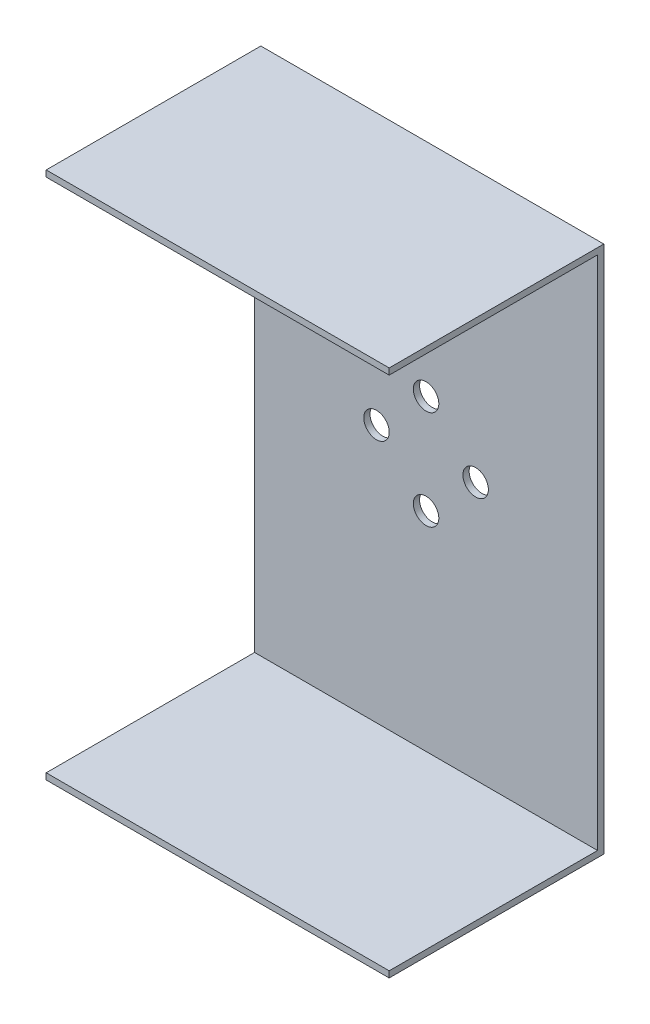
ISO-10303-21;
HEADER;
FILE_DESCRIPTION(('STEP AP214'),'2;1');
FILE_NAME('part.step','',(''),(''),'','','');
FILE_SCHEMA(('AUTOMOTIVE_DESIGN { 1 0 10303 214 1 1 1 1 }'));
ENDSEC;
DATA;
#1=APPLICATION_CONTEXT('core data for automotive mechanical design processes');
#2=APPLICATION_PROTOCOL_DEFINITION('international standard','automotive_design',2000,#1);
#3=PRODUCT_CONTEXT('',#1,'mechanical');
#4=PRODUCT('Part','Part','',(#3));
#5=PRODUCT_RELATED_PRODUCT_CATEGORY('part','',(#4));
#6=PRODUCT_DEFINITION_FORMATION('','',#4);
#7=PRODUCT_DEFINITION_CONTEXT('part definition',#1,'design');
#8=PRODUCT_DEFINITION('design','',#6,#7);
#9=PRODUCT_DEFINITION_SHAPE('','',#8);
#10=(LENGTH_UNIT() NAMED_UNIT(*) SI_UNIT(.MILLI.,.METRE.));
#11=(NAMED_UNIT(*) PLANE_ANGLE_UNIT() SI_UNIT($,.RADIAN.));
#12=(NAMED_UNIT(*) SI_UNIT($,.STERADIAN.) SOLID_ANGLE_UNIT());
#13=UNCERTAINTY_MEASURE_WITH_UNIT(LENGTH_MEASURE(1.E-05),#10,'distance_accuracy_value','');
#14=(GEOMETRIC_REPRESENTATION_CONTEXT(3) GLOBAL_UNCERTAINTY_ASSIGNED_CONTEXT((#13)) GLOBAL_UNIT_ASSIGNED_CONTEXT((#10,
#11,#12)) REPRESENTATION_CONTEXT('',''));
#15=CARTESIAN_POINT('',(0.,0.,0.));
#16=DIRECTION('',(0.,0.,1.));
#17=DIRECTION('',(1.,0.,0.));
#18=AXIS2_PLACEMENT_3D('',#15,#16,#17);
#19=CARTESIAN_POINT('',(87.89068,0.,-55.));
#20=DIRECTION('',(0.,-1.,0.));
#21=DIRECTION('',(0.,0.,-1.));
#22=AXIS2_PLACEMENT_3D('',#19,#20,#21);
#23=PLANE('',#22);
#24=DIRECTION('',(0.,0.,1.));
#25=VECTOR('',#24,1.);
#26=CARTESIAN_POINT('',(0.,0.,-55.));
#27=LINE('',#26,#25);
#28=CARTESIAN_POINT('',(0.,0.,-55.));
#29=VERTEX_POINT('',#28);
#30=CARTESIAN_POINT('',(0.,0.,0.));
#31=VERTEX_POINT('',#30);
#32=EDGE_CURVE('E144',#29,#31,#27,.T.);
#33=ORIENTED_EDGE('',*,*,#32,.T.);
#34=DIRECTION('',(-1.,0.,0.));
#35=VECTOR('',#34,1.);
#36=CARTESIAN_POINT('',(87.89068,0.,0.));
#37=LINE('',#36,#35);
#38=CARTESIAN_POINT('',(87.89068,0.,0.));
#39=VERTEX_POINT('',#38);
#40=EDGE_CURVE('E11',#39,#31,#37,.T.);
#41=ORIENTED_EDGE('',*,*,#40,.F.);
#42=DIRECTION('',(0.,0.,1.));
#43=VECTOR('',#42,1.);
#44=CARTESIAN_POINT('',(87.89068,0.,-55.));
#45=LINE('',#44,#43);
#46=CARTESIAN_POINT('',(87.89068,0.,-55.));
#47=VERTEX_POINT('',#46);
#48=EDGE_CURVE('E167',#47,#39,#45,.T.);
#49=ORIENTED_EDGE('',*,*,#48,.F.);
#50=DIRECTION('',(-1.,0.,0.));
#51=VECTOR('',#50,1.);
#52=CARTESIAN_POINT('',(87.89068,0.,-55.));
#53=LINE('',#52,#51);
#54=EDGE_CURVE('E140',#47,#29,#53,.T.);
#55=ORIENTED_EDGE('',*,*,#54,.T.);
#56=EDGE_LOOP('',(#33,#41,#49,#55));
#57=FACE_BOUND('',#56,.T.);
#58=ADVANCED_FACE('F43',(#57),#23,.F.);
#59=CARTESIAN_POINT('',(87.89068,0.,0.));
#60=DIRECTION('',(0.,0.,-1.));
#61=DIRECTION('',(0.,1.,0.));
#62=AXIS2_PLACEMENT_3D('',#59,#60,#61);
#63=PLANE('',#62);
#64=DIRECTION('',(0.,-1.,0.));
#65=VECTOR('',#64,1.);
#66=CARTESIAN_POINT('',(0.,0.,0.));
#67=LINE('',#66,#65);
#68=CARTESIAN_POINT('',(0.,-1.6002,0.));
#69=VERTEX_POINT('',#68);
#70=EDGE_CURVE('E148',#31,#69,#67,.T.);
#71=ORIENTED_EDGE('',*,*,#70,.T.);
#72=DIRECTION('',(-1.,0.,0.));
#73=VECTOR('',#72,1.);
#74=CARTESIAN_POINT('',(87.89068,-1.6002,0.));
#75=LINE('',#74,#73);
#76=CARTESIAN_POINT('',(87.89068,-1.6002,0.));
#77=VERTEX_POINT('',#76);
#78=EDGE_CURVE('E52',#77,#69,#75,.T.);
#79=ORIENTED_EDGE('',*,*,#78,.F.);
#80=DIRECTION('',(0.,-1.,0.));
#81=VECTOR('',#80,1.);
#82=CARTESIAN_POINT('',(87.89068,0.,0.));
#83=LINE('',#82,#81);
#84=EDGE_CURVE('E103',#39,#77,#83,.T.);
#85=ORIENTED_EDGE('',*,*,#84,.F.);
#86=ORIENTED_EDGE('',*,*,#40,.T.);
#87=EDGE_LOOP('',(#71,#79,#85,#86));
#88=FACE_BOUND('',#87,.T.);
#89=ADVANCED_FACE('F269',(#88),#63,.F.);
#90=CARTESIAN_POINT('',(87.89068,-1.6002,0.));
#91=DIRECTION('',(0.,1.,0.));
#92=DIRECTION('',(0.,0.,1.));
#93=AXIS2_PLACEMENT_3D('',#90,#91,#92);
#94=PLANE('',#93);
#95=DIRECTION('',(0.,0.,-1.));
#96=VECTOR('',#95,1.);
#97=CARTESIAN_POINT('',(0.,-1.6002,0.));
#98=LINE('',#97,#96);
#99=CARTESIAN_POINT('',(0.,-1.6002,-53.3998));
#100=VERTEX_POINT('',#99);
#101=EDGE_CURVE('E152',#69,#100,#98,.T.);
#102=ORIENTED_EDGE('',*,*,#101,.T.);
#103=DIRECTION('',(-1.,0.,0.));
#104=VECTOR('',#103,1.);
#105=CARTESIAN_POINT('',(87.89068,-1.6002,-53.3998));
#106=LINE('',#105,#104);
#107=CARTESIAN_POINT('',(87.89068,-1.6002,-53.3998));
#108=VERTEX_POINT('',#107);
#109=EDGE_CURVE('E178',#108,#100,#106,.T.);
#110=ORIENTED_EDGE('',*,*,#109,.F.);
#111=DIRECTION('',(0.,0.,-1.));
#112=VECTOR('',#111,1.);
#113=CARTESIAN_POINT('',(87.89068,-1.6002,0.));
#114=LINE('',#113,#112);
#115=EDGE_CURVE('E188',#77,#108,#114,.T.);
#116=ORIENTED_EDGE('',*,*,#115,.F.);
#117=ORIENTED_EDGE('',*,*,#78,.T.);
#118=EDGE_LOOP('',(#102,#110,#116,#117));
#119=FACE_BOUND('',#118,.T.);
#120=ADVANCED_FACE('F186',(#119),#94,.F.);
#121=CARTESIAN_POINT('',(87.89068,-1.6002,-53.3998));
#122=DIRECTION('',(0.,0.,-1.));
#123=DIRECTION('',(0.,1.,0.));
#124=AXIS2_PLACEMENT_3D('',#121,#122,#123);
#125=PLANE('',#124);
#126=CARTESIAN_POINT('',(43.94534,-54.99395,-53.3998));
#127=DIRECTION('',(0.,0.,1.));
#128=DIRECTION('',(1.,0.,0.));
#129=AXIS2_PLACEMENT_3D('',#126,#127,#128);
#130=CIRCLE('',#129,3.2639);
#131=CARTESIAN_POINT('',(47.20924,-54.99395,-53.3998));
#132=VERTEX_POINT('',#131);
#133=EDGE_CURVE('E232',#132,#132,#130,.T.);
#134=ORIENTED_EDGE('',*,*,#133,.F.);
#135=EDGE_LOOP('',(#134));
#136=FACE_BOUND('',#135,.T.);
#137=CARTESIAN_POINT('',(43.94534,-80.39395,-53.3998));
#138=DIRECTION('',(0.,0.,1.));
#139=DIRECTION('',(1.,0.,0.));
#140=AXIS2_PLACEMENT_3D('',#137,#138,#139);
#141=CIRCLE('',#140,3.2639);
#142=CARTESIAN_POINT('',(47.20924,-80.39395,-53.3998));
#143=VERTEX_POINT('',#142);
#144=EDGE_CURVE('E228',#143,#143,#141,.T.);
#145=ORIENTED_EDGE('',*,*,#144,.F.);
#146=EDGE_LOOP('',(#145));
#147=FACE_BOUND('',#146,.T.);
#148=CARTESIAN_POINT('',(31.24534,-67.69395,-53.3998));
#149=DIRECTION('',(0.,0.,1.));
#150=DIRECTION('',(1.,0.,0.));
#151=AXIS2_PLACEMENT_3D('',#148,#149,#150);
#152=CIRCLE('',#151,3.26390000000002);
#153=CARTESIAN_POINT('',(34.50924,-67.69395,-53.3998));
#154=VERTEX_POINT('',#153);
#155=EDGE_CURVE('E220',#154,#154,#152,.T.);
#156=ORIENTED_EDGE('',*,*,#155,.F.);
#157=EDGE_LOOP('',(#156));
#158=FACE_BOUND('',#157,.T.);
#159=CARTESIAN_POINT('',(56.64534,-67.69395,-53.3998));
#160=DIRECTION('',(0.,0.,1.));
#161=DIRECTION('',(1.,0.,0.));
#162=AXIS2_PLACEMENT_3D('',#159,#160,#161);
#163=CIRCLE('',#162,3.2639);
#164=CARTESIAN_POINT('',(59.90924,-67.69395,-53.3998));
#165=VERTEX_POINT('',#164);
#166=EDGE_CURVE('E211',#165,#165,#163,.T.);
#167=ORIENTED_EDGE('',*,*,#166,.F.);
#168=EDGE_LOOP('',(#167));
#169=FACE_BOUND('',#168,.T.);
#170=DIRECTION('',(0.,-1.,0.));
#171=VECTOR('',#170,1.);
#172=CARTESIAN_POINT('',(0.,-1.6002,-53.3998));
#173=LINE('',#172,#171);
#174=CARTESIAN_POINT('',(0.,-133.7877,-53.3998));
#175=VERTEX_POINT('',#174);
#176=EDGE_CURVE('E155',#100,#175,#173,.T.);
#177=ORIENTED_EDGE('',*,*,#176,.T.);
#178=DIRECTION('',(-1.,0.,0.));
#179=VECTOR('',#178,1.);
#180=CARTESIAN_POINT('',(87.89068,-133.7877,-53.3998));
#181=LINE('',#180,#179);
#182=CARTESIAN_POINT('',(87.89068,-133.7877,-53.3998));
#183=VERTEX_POINT('',#182);
#184=EDGE_CURVE('E174',#183,#175,#181,.T.);
#185=ORIENTED_EDGE('',*,*,#184,.F.);
#186=DIRECTION('',(0.,-1.,0.));
#187=VECTOR('',#186,1.);
#188=CARTESIAN_POINT('',(87.89068,-1.6002,-53.3998));
#189=LINE('',#188,#187);
#190=EDGE_CURVE('E201',#108,#183,#189,.T.);
#191=ORIENTED_EDGE('',*,*,#190,.F.);
#192=ORIENTED_EDGE('',*,*,#109,.T.);
#193=EDGE_LOOP('',(#177,#185,#191,#192));
#194=FACE_BOUND('',#193,.T.);
#195=ADVANCED_FACE('F196',(#136,#147,#158,#169,#194),#125,.F.);
#196=CARTESIAN_POINT('',(87.89068,-133.7877,-53.3998));
#197=DIRECTION('',(0.,-1.,0.));
#198=DIRECTION('',(0.,0.,-1.));
#199=AXIS2_PLACEMENT_3D('',#196,#197,#198);
#200=PLANE('',#199);
#201=DIRECTION('',(0.,0.,1.));
#202=VECTOR('',#201,1.);
#203=CARTESIAN_POINT('',(0.,-133.7877,-53.3998));
#204=LINE('',#203,#202);
#205=CARTESIAN_POINT('',(0.,-133.7877,0.));
#206=VERTEX_POINT('',#205);
#207=EDGE_CURVE('E158',#175,#206,#204,.T.);
#208=ORIENTED_EDGE('',*,*,#207,.T.);
#209=DIRECTION('',(-1.,0.,0.));
#210=VECTOR('',#209,1.);
#211=CARTESIAN_POINT('',(87.89068,-133.7877,0.));
#212=LINE('',#211,#210);
#213=CARTESIAN_POINT('',(87.89068,-133.7877,0.));
#214=VERTEX_POINT('',#213);
#215=EDGE_CURVE('E133',#214,#206,#212,.T.);
#216=ORIENTED_EDGE('',*,*,#215,.F.);
#217=DIRECTION('',(0.,0.,1.));
#218=VECTOR('',#217,1.);
#219=CARTESIAN_POINT('',(87.89068,-133.7877,-53.3998));
#220=LINE('',#219,#218);
#221=EDGE_CURVE('E122',#183,#214,#220,.T.);
#222=ORIENTED_EDGE('',*,*,#221,.F.);
#223=ORIENTED_EDGE('',*,*,#184,.T.);
#224=EDGE_LOOP('',(#208,#216,#222,#223));
#225=FACE_BOUND('',#224,.T.);
#226=ADVANCED_FACE('F199',(#225),#200,.F.);
#227=CARTESIAN_POINT('',(87.89068,-133.7877,0.));
#228=DIRECTION('',(0.,0.,-1.));
#229=DIRECTION('',(0.,1.,0.));
#230=AXIS2_PLACEMENT_3D('',#227,#228,#229);
#231=PLANE('',#230);
#232=DIRECTION('',(0.,-1.,0.));
#233=VECTOR('',#232,1.);
#234=CARTESIAN_POINT('',(0.,-133.7877,0.));
#235=LINE('',#234,#233);
#236=CARTESIAN_POINT('',(0.,-135.3879,0.));
#237=VERTEX_POINT('',#236);
#238=EDGE_CURVE('E131',#206,#237,#235,.T.);
#239=ORIENTED_EDGE('',*,*,#238,.T.);
#240=DIRECTION('',(-1.,0.,0.));
#241=VECTOR('',#240,1.);
#242=CARTESIAN_POINT('',(87.89068,-135.3879,0.));
#243=LINE('',#242,#241);
#244=CARTESIAN_POINT('',(87.89068,-135.3879,0.));
#245=VERTEX_POINT('',#244);
#246=EDGE_CURVE('E128',#245,#237,#243,.T.);
#247=ORIENTED_EDGE('',*,*,#246,.F.);
#248=DIRECTION('',(0.,-1.,0.));
#249=VECTOR('',#248,1.);
#250=CARTESIAN_POINT('',(87.89068,-133.7877,0.));
#251=LINE('',#250,#249);
#252=EDGE_CURVE('E116',#214,#245,#251,.T.);
#253=ORIENTED_EDGE('',*,*,#252,.F.);
#254=ORIENTED_EDGE('',*,*,#215,.T.);
#255=EDGE_LOOP('',(#239,#247,#253,#254));
#256=FACE_BOUND('',#255,.T.);
#257=ADVANCED_FACE('F129',(#256),#231,.F.);
#258=CARTESIAN_POINT('',(87.89068,-135.3879,0.));
#259=DIRECTION('',(0.,1.,0.));
#260=DIRECTION('',(0.,0.,1.));
#261=AXIS2_PLACEMENT_3D('',#258,#259,#260);
#262=PLANE('',#261);
#263=DIRECTION('',(0.,0.,-1.));
#264=VECTOR('',#263,1.);
#265=CARTESIAN_POINT('',(0.,-135.3879,0.));
#266=LINE('',#265,#264);
#267=CARTESIAN_POINT('',(0.,-135.3879,-55.));
#268=VERTEX_POINT('',#267);
#269=EDGE_CURVE('E89',#237,#268,#266,.T.);
#270=ORIENTED_EDGE('',*,*,#269,.T.);
#271=DIRECTION('',(-1.,0.,0.));
#272=VECTOR('',#271,1.);
#273=CARTESIAN_POINT('',(87.89068,-135.3879,-55.));
#274=LINE('',#273,#272);
#275=CARTESIAN_POINT('',(87.89068,-135.3879,-55.));
#276=VERTEX_POINT('',#275);
#277=EDGE_CURVE('E134',#276,#268,#274,.T.);
#278=ORIENTED_EDGE('',*,*,#277,.F.);
#279=DIRECTION('',(0.,0.,-1.));
#280=VECTOR('',#279,1.);
#281=CARTESIAN_POINT('',(87.89068,-135.3879,0.));
#282=LINE('',#281,#280);
#283=EDGE_CURVE('E120',#245,#276,#282,.T.);
#284=ORIENTED_EDGE('',*,*,#283,.F.);
#285=ORIENTED_EDGE('',*,*,#246,.T.);
#286=EDGE_LOOP('',(#270,#278,#284,#285));
#287=FACE_BOUND('',#286,.T.);
#288=ADVANCED_FACE('F136',(#287),#262,.F.);
#289=CARTESIAN_POINT('',(87.89068,-135.3879,-55.));
#290=DIRECTION('',(0.,0.,1.));
#291=DIRECTION('',(1.,0.,0.));
#292=AXIS2_PLACEMENT_3D('',#289,#290,#291);
#293=PLANE('',#292);
#294=CARTESIAN_POINT('',(43.94534,-54.99395,-55.));
#295=DIRECTION('',(0.,0.,1.));
#296=DIRECTION('',(1.,0.,0.));
#297=AXIS2_PLACEMENT_3D('',#294,#295,#296);
#298=CIRCLE('',#297,3.2639);
#299=CARTESIAN_POINT('',(47.20924,-54.99395,-55.));
#300=VERTEX_POINT('',#299);
#301=EDGE_CURVE('E149',#300,#300,#298,.F.);
#302=ORIENTED_EDGE('',*,*,#301,.F.);
#303=EDGE_LOOP('',(#302));
#304=FACE_BOUND('',#303,.T.);
#305=CARTESIAN_POINT('',(43.94534,-80.39395,-55.));
#306=DIRECTION('',(0.,0.,1.));
#307=DIRECTION('',(1.,0.,0.));
#308=AXIS2_PLACEMENT_3D('',#305,#306,#307);
#309=CIRCLE('',#308,3.2639);
#310=CARTESIAN_POINT('',(47.20924,-80.39395,-55.));
#311=VERTEX_POINT('',#310);
#312=EDGE_CURVE('E224',#311,#311,#309,.F.);
#313=ORIENTED_EDGE('',*,*,#312,.F.);
#314=EDGE_LOOP('',(#313));
#315=FACE_BOUND('',#314,.T.);
#316=CARTESIAN_POINT('',(31.24534,-67.69395,-55.));
#317=DIRECTION('',(0.,0.,1.));
#318=DIRECTION('',(1.,0.,0.));
#319=AXIS2_PLACEMENT_3D('',#316,#317,#318);
#320=CIRCLE('',#319,3.26390000000002);
#321=CARTESIAN_POINT('',(34.50924,-67.69395,-55.));
#322=VERTEX_POINT('',#321);
#323=EDGE_CURVE('E215',#322,#322,#320,.F.);
#324=ORIENTED_EDGE('',*,*,#323,.F.);
#325=EDGE_LOOP('',(#324));
#326=FACE_BOUND('',#325,.T.);
#327=CARTESIAN_POINT('',(56.64534,-67.69395,-55.));
#328=DIRECTION('',(0.,0.,1.));
#329=DIRECTION('',(1.,0.,0.));
#330=AXIS2_PLACEMENT_3D('',#327,#328,#329);
#331=CIRCLE('',#330,3.2639);
#332=CARTESIAN_POINT('',(59.90924,-67.69395,-55.));
#333=VERTEX_POINT('',#332);
#334=EDGE_CURVE('E216',#333,#333,#331,.F.);
#335=ORIENTED_EDGE('',*,*,#334,.F.);
#336=EDGE_LOOP('',(#335));
#337=FACE_BOUND('',#336,.T.);
#338=DIRECTION('',(0.,1.,0.));
#339=VECTOR('',#338,1.);
#340=CARTESIAN_POINT('',(0.,-135.3879,-55.));
#341=LINE('',#340,#339);
#342=EDGE_CURVE('E95',#268,#29,#341,.T.);
#343=ORIENTED_EDGE('',*,*,#342,.T.);
#344=ORIENTED_EDGE('',*,*,#54,.F.);
#345=DIRECTION('',(0.,1.,0.));
#346=VECTOR('',#345,1.);
#347=CARTESIAN_POINT('',(87.89068,-135.3879,-55.));
#348=LINE('',#347,#346);
#349=EDGE_CURVE('E60',#276,#47,#348,.T.);
#350=ORIENTED_EDGE('',*,*,#349,.F.);
#351=ORIENTED_EDGE('',*,*,#277,.T.);
#352=EDGE_LOOP('',(#343,#344,#350,#351));
#353=FACE_BOUND('',#352,.T.);
#354=ADVANCED_FACE('F276',(#304,#315,#326,#337,#353),#293,.F.);
#355=CARTESIAN_POINT('',(87.89068,0.,0.));
#356=DIRECTION('',(1.,0.,0.));
#357=DIRECTION('',(0.,0.,-1.));
#358=AXIS2_PLACEMENT_3D('',#355,#356,#357);
#359=PLANE('',#358);
#360=ORIENTED_EDGE('',*,*,#48,.T.);
#361=ORIENTED_EDGE('',*,*,#84,.T.);
#362=ORIENTED_EDGE('',*,*,#115,.T.);
#363=ORIENTED_EDGE('',*,*,#190,.T.);
#364=ORIENTED_EDGE('',*,*,#221,.T.);
#365=ORIENTED_EDGE('',*,*,#252,.T.);
#366=ORIENTED_EDGE('',*,*,#283,.T.);
#367=ORIENTED_EDGE('',*,*,#349,.T.);
#368=EDGE_LOOP('',(#360,#361,#362,#363,#364,#365,#366,#367));
#369=FACE_BOUND('',#368,.T.);
#370=ADVANCED_FACE('F118',(#369),#359,.T.);
#371=CARTESIAN_POINT('',(0.,0.,0.));
#372=DIRECTION('',(1.,0.,0.));
#373=DIRECTION('',(0.,0.,-1.));
#374=AXIS2_PLACEMENT_3D('',#371,#372,#373);
#375=PLANE('',#374);
#376=ORIENTED_EDGE('',*,*,#32,.F.);
#377=ORIENTED_EDGE('',*,*,#342,.F.);
#378=ORIENTED_EDGE('',*,*,#269,.F.);
#379=ORIENTED_EDGE('',*,*,#238,.F.);
#380=ORIENTED_EDGE('',*,*,#207,.F.);
#381=ORIENTED_EDGE('',*,*,#176,.F.);
#382=ORIENTED_EDGE('',*,*,#101,.F.);
#383=ORIENTED_EDGE('',*,*,#70,.F.);
#384=EDGE_LOOP('',(#376,#377,#378,#379,#380,#381,#382,#383));
#385=FACE_BOUND('',#384,.T.);
#386=ADVANCED_FACE('F192',(#385),#375,.F.);
#387=CARTESIAN_POINT('',(56.64534,-67.69395,-64.2317032924592));
#388=DIRECTION('',(0.,0.,1.));
#389=DIRECTION('',(1.,0.,0.));
#390=AXIS2_PLACEMENT_3D('',#387,#388,#389);
#391=CYLINDRICAL_SURFACE('',#390,3.2639);
#392=ORIENTED_EDGE('',*,*,#334,.T.);
#393=EDGE_LOOP('',(#392));
#394=FACE_BOUND('',#393,.T.);
#395=ORIENTED_EDGE('',*,*,#166,.T.);
#396=EDGE_LOOP('',(#395));
#397=FACE_BOUND('',#396,.T.);
#398=ADVANCED_FACE('F254',(#394,#397),#391,.F.);
#399=CARTESIAN_POINT('',(31.24534,-67.69395,-64.2317032924592));
#400=DIRECTION('',(0.,0.,1.));
#401=DIRECTION('',(1.,0.,0.));
#402=AXIS2_PLACEMENT_3D('',#399,#400,#401);
#403=CYLINDRICAL_SURFACE('',#402,3.26390000000002);
#404=ORIENTED_EDGE('',*,*,#323,.T.);
#405=EDGE_LOOP('',(#404));
#406=FACE_BOUND('',#405,.T.);
#407=ORIENTED_EDGE('',*,*,#155,.T.);
#408=EDGE_LOOP('',(#407));
#409=FACE_BOUND('',#408,.T.);
#410=ADVANCED_FACE('F256',(#406,#409),#403,.F.);
#411=CARTESIAN_POINT('',(43.94534,-80.39395,-64.2317032924592));
#412=DIRECTION('',(0.,0.,1.));
#413=DIRECTION('',(1.,0.,0.));
#414=AXIS2_PLACEMENT_3D('',#411,#412,#413);
#415=CYLINDRICAL_SURFACE('',#414,3.2639);
#416=ORIENTED_EDGE('',*,*,#312,.T.);
#417=EDGE_LOOP('',(#416));
#418=FACE_BOUND('',#417,.T.);
#419=ORIENTED_EDGE('',*,*,#144,.T.);
#420=EDGE_LOOP('',(#419));
#421=FACE_BOUND('',#420,.T.);
#422=ADVANCED_FACE('F263',(#418,#421),#415,.F.);
#423=CARTESIAN_POINT('',(43.94534,-54.99395,-64.2317032924592));
#424=DIRECTION('',(0.,0.,1.));
#425=DIRECTION('',(1.,0.,0.));
#426=AXIS2_PLACEMENT_3D('',#423,#424,#425);
#427=CYLINDRICAL_SURFACE('',#426,3.2639);
#428=ORIENTED_EDGE('',*,*,#301,.T.);
#429=EDGE_LOOP('',(#428));
#430=FACE_BOUND('',#429,.T.);
#431=ORIENTED_EDGE('',*,*,#133,.T.);
#432=EDGE_LOOP('',(#431));
#433=FACE_BOUND('',#432,.T.);
#434=ADVANCED_FACE('F243',(#430,#433),#427,.F.);
#435=CLOSED_SHELL('',(#58,#89,#120,#195,#226,#257,#288,#354,#370,#386,#398,#410,#422,#434));
#436=MANIFOLD_SOLID_BREP('B2',#435);
#437=ADVANCED_BREP_SHAPE_REPRESENTATION('',(#18,#436),#14);
#438=SHAPE_DEFINITION_REPRESENTATION(#9,#437);
ENDSEC;
END-ISO-10303-21;
